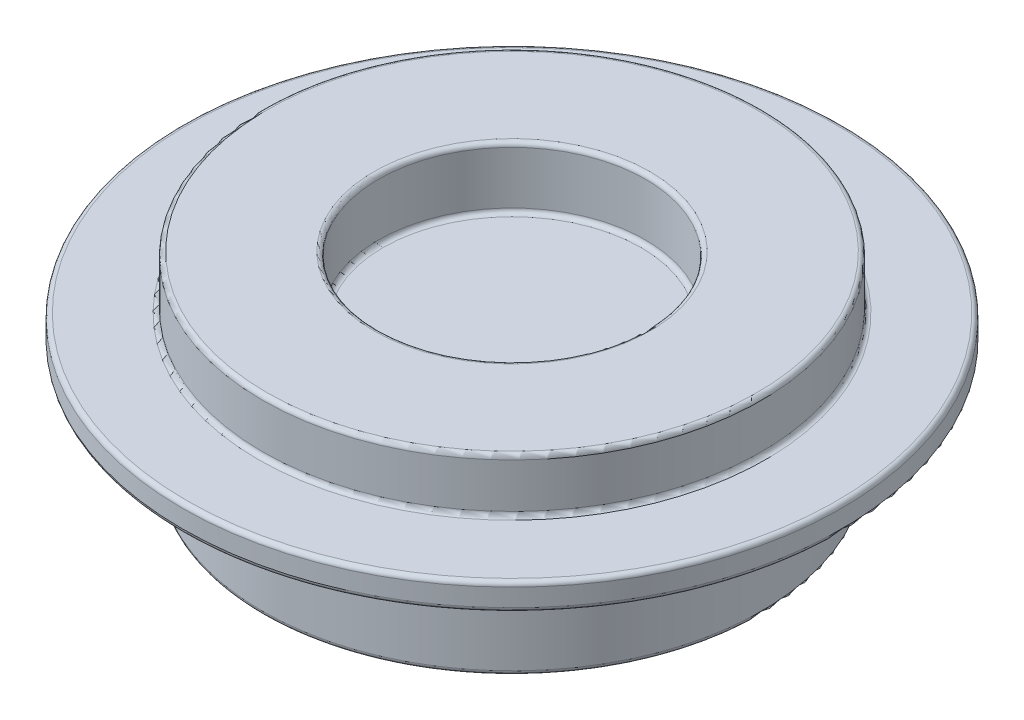
ISO-10303-21;
HEADER;
FILE_DESCRIPTION(('STEP AP214'),'2;1');
FILE_NAME('part.step','',(''),(''),'','','');
FILE_SCHEMA(('AUTOMOTIVE_DESIGN { 1 0 10303 214 1 1 1 1 }'));
ENDSEC;
DATA;
#1=APPLICATION_CONTEXT('core data for automotive mechanical design processes');
#2=APPLICATION_PROTOCOL_DEFINITION('international standard','automotive_design',2000,#1);
#3=PRODUCT_CONTEXT('',#1,'mechanical');
#4=PRODUCT('Part','Part','',(#3));
#5=PRODUCT_RELATED_PRODUCT_CATEGORY('part','',(#4));
#6=PRODUCT_DEFINITION_FORMATION('','',#4);
#7=PRODUCT_DEFINITION_CONTEXT('part definition',#1,'design');
#8=PRODUCT_DEFINITION('design','',#6,#7);
#9=PRODUCT_DEFINITION_SHAPE('','',#8);
#10=(LENGTH_UNIT() NAMED_UNIT(*) SI_UNIT(.MILLI.,.METRE.));
#11=(NAMED_UNIT(*) PLANE_ANGLE_UNIT() SI_UNIT($,.RADIAN.));
#12=(NAMED_UNIT(*) SI_UNIT($,.STERADIAN.) SOLID_ANGLE_UNIT());
#13=UNCERTAINTY_MEASURE_WITH_UNIT(LENGTH_MEASURE(1.E-05),#10,'distance_accuracy_value','');
#14=(GEOMETRIC_REPRESENTATION_CONTEXT(3) GLOBAL_UNCERTAINTY_ASSIGNED_CONTEXT((#13)) GLOBAL_UNIT_ASSIGNED_CONTEXT((#10,
#11,#12)) REPRESENTATION_CONTEXT('',''));
#15=CARTESIAN_POINT('',(0.,0.,0.));
#16=DIRECTION('',(0.,0.,1.));
#17=DIRECTION('',(1.,0.,0.));
#18=AXIS2_PLACEMENT_3D('',#15,#16,#17);
#19=CARTESIAN_POINT('',(0.,8.16014669926651,0.));
#20=DIRECTION('',(0.,1.,0.));
#21=DIRECTION('',(0.,0.,1.));
#22=AXIS2_PLACEMENT_3D('',#19,#20,#21);
#23=CYLINDRICAL_SURFACE('',#22,14.);
#24=CARTESIAN_POINT('',(0.,1.74266503667482,0.));
#25=DIRECTION('',(0.,1.,0.));
#26=DIRECTION('',(0.,0.,1.));
#27=AXIS2_PLACEMENT_3D('',#24,#25,#26);
#28=CIRCLE('',#27,14.);
#29=CARTESIAN_POINT('',(0.,1.74266503667482,14.));
#30=VERTEX_POINT('',#29);
#31=EDGE_CURVE('E60',#30,#30,#28,.T.);
#32=ORIENTED_EDGE('',*,*,#31,.T.);
#33=EDGE_LOOP('',(#32));
#34=FACE_BOUND('',#33,.T.);
#35=CARTESIAN_POINT('',(0.,4.24266503667482,0.));
#36=DIRECTION('',(0.,1.,0.));
#37=DIRECTION('',(0.,0.,1.));
#38=AXIS2_PLACEMENT_3D('',#35,#36,#37);
#39=CIRCLE('',#38,14.);
#40=CARTESIAN_POINT('',(0.,4.24266503667482,14.));
#41=VERTEX_POINT('',#40);
#42=EDGE_CURVE('E63',#41,#41,#39,.F.);
#43=ORIENTED_EDGE('',*,*,#42,.T.);
#44=EDGE_LOOP('',(#43));
#45=FACE_BOUND('',#44,.T.);
#46=ADVANCED_FACE('F37',(#34,#45),#23,.T.);
#47=CARTESIAN_POINT('',(-14.,4.49266503667482,0.));
#48=DIRECTION('',(0.,1.,0.));
#49=DIRECTION('',(0.,0.,1.));
#50=AXIS2_PLACEMENT_3D('',#47,#48,#49);
#51=PLANE('',#50);
#52=CARTESIAN_POINT('',(0.,4.49266503667482,0.));
#53=DIRECTION('',(0.,1.,0.));
#54=DIRECTION('',(0.,0.,1.));
#55=AXIS2_PLACEMENT_3D('',#52,#53,#54);
#56=CIRCLE('',#55,7.75);
#57=CARTESIAN_POINT('',(0.,4.49266503667482,7.75));
#58=VERTEX_POINT('',#57);
#59=EDGE_CURVE('E78',#58,#58,#56,.F.);
#60=ORIENTED_EDGE('',*,*,#59,.T.);
#61=EDGE_LOOP('',(#60));
#62=FACE_BOUND('',#61,.T.);
#63=CARTESIAN_POINT('',(0.,4.49266503667482,0.));
#64=DIRECTION('',(0.,1.,0.));
#65=DIRECTION('',(0.,0.,1.));
#66=AXIS2_PLACEMENT_3D('',#63,#64,#65);
#67=CIRCLE('',#66,13.75);
#68=CARTESIAN_POINT('',(0.,4.49266503667482,13.75));
#69=VERTEX_POINT('',#68);
#70=EDGE_CURVE('E81',#69,#69,#67,.T.);
#71=ORIENTED_EDGE('',*,*,#70,.T.);
#72=EDGE_LOOP('',(#71));
#73=FACE_BOUND('',#72,.T.);
#74=ADVANCED_FACE('F115',(#62,#73),#51,.T.);
#75=CARTESIAN_POINT('',(0.,8.16014669926651,0.));
#76=DIRECTION('',(0.,1.,0.));
#77=DIRECTION('',(0.,0.,1.));
#78=AXIS2_PLACEMENT_3D('',#75,#76,#77);
#79=CYLINDRICAL_SURFACE('',#78,7.5);
#80=CARTESIAN_POINT('',(0.,1.29523227383863,0.));
#81=DIRECTION('',(0.,1.,0.));
#82=DIRECTION('',(0.,0.,1.));
#83=AXIS2_PLACEMENT_3D('',#80,#81,#82);
#84=CIRCLE('',#83,7.5);
#85=CARTESIAN_POINT('',(0.,1.29523227383863,7.5));
#86=VERTEX_POINT('',#85);
#87=EDGE_CURVE('E84',#86,#86,#84,.F.);
#88=ORIENTED_EDGE('',*,*,#87,.T.);
#89=EDGE_LOOP('',(#88));
#90=FACE_BOUND('',#89,.T.);
#91=CARTESIAN_POINT('',(0.,4.24266503667482,0.));
#92=DIRECTION('',(0.,1.,0.));
#93=DIRECTION('',(0.,0.,1.));
#94=AXIS2_PLACEMENT_3D('',#91,#92,#93);
#95=CIRCLE('',#94,7.5);
#96=CARTESIAN_POINT('',(0.,4.24266503667482,7.5));
#97=VERTEX_POINT('',#96);
#98=EDGE_CURVE('E87',#97,#97,#95,.T.);
#99=ORIENTED_EDGE('',*,*,#98,.T.);
#100=EDGE_LOOP('',(#99));
#101=FACE_BOUND('',#100,.T.);
#102=ADVANCED_FACE('F120',(#90,#101),#79,.F.);
#103=CARTESIAN_POINT('',(-7.5,1.04523227383863,0.));
#104=DIRECTION('',(0.,1.,0.));
#105=DIRECTION('',(0.,0.,1.));
#106=AXIS2_PLACEMENT_3D('',#103,#104,#105);
#107=PLANE('',#106);
#108=CARTESIAN_POINT('',(0.,1.04523227383863,0.));
#109=DIRECTION('',(0.,1.,0.));
#110=DIRECTION('',(0.,0.,1.));
#111=AXIS2_PLACEMENT_3D('',#108,#109,#110);
#112=CIRCLE('',#111,7.25);
#113=CARTESIAN_POINT('',(0.,1.04523227383863,7.25));
#114=VERTEX_POINT('',#113);
#115=EDGE_CURVE('E90',#114,#114,#112,.T.);
#116=ORIENTED_EDGE('',*,*,#115,.T.);
#117=EDGE_LOOP('',(#116));
#118=FACE_BOUND('',#117,.T.);
#119=ADVANCED_FACE('F94',(#118),#107,.T.);
#120=CARTESIAN_POINT('',(-14.,-6.25733496332518,0.));
#121=DIRECTION('',(0.,-1.,0.));
#122=DIRECTION('',(0.,0.,-1.));
#123=AXIS2_PLACEMENT_3D('',#120,#121,#122);
#124=PLANE('',#123);
#125=CARTESIAN_POINT('',(0.,-6.25733496332518,0.));
#126=DIRECTION('',(0.,-1.,0.));
#127=DIRECTION('',(0.,0.,-1.));
#128=AXIS2_PLACEMENT_3D('',#125,#126,#127);
#129=CIRCLE('',#128,13.75);
#130=CARTESIAN_POINT('',(0.,-6.25733496332518,-13.75));
#131=VERTEX_POINT('',#130);
#132=EDGE_CURVE('E48',#131,#131,#129,.T.);
#133=ORIENTED_EDGE('',*,*,#132,.T.);
#134=EDGE_LOOP('',(#133));
#135=FACE_BOUND('',#134,.T.);
#136=ADVANCED_FACE('F130',(#135),#124,.T.);
#137=CARTESIAN_POINT('',(0.,8.16014669926651,0.));
#138=DIRECTION('',(0.,1.,0.));
#139=DIRECTION('',(0.,0.,1.));
#140=AXIS2_PLACEMENT_3D('',#137,#138,#139);
#141=CYLINDRICAL_SURFACE('',#140,14.);
#142=CARTESIAN_POINT('',(0.,-0.25733496332518,0.));
#143=DIRECTION('',(0.,-1.,0.));
#144=DIRECTION('',(0.,0.,-1.));
#145=AXIS2_PLACEMENT_3D('',#142,#143,#144);
#146=CIRCLE('',#145,14.);
#147=CARTESIAN_POINT('',(0.,-0.25733496332518,-14.));
#148=VERTEX_POINT('',#147);
#149=EDGE_CURVE('E66',#148,#148,#146,.T.);
#150=ORIENTED_EDGE('',*,*,#149,.T.);
#151=EDGE_LOOP('',(#150));
#152=FACE_BOUND('',#151,.T.);
#153=CARTESIAN_POINT('',(0.,-6.00733496332518,0.));
#154=DIRECTION('',(0.,-1.,0.));
#155=DIRECTION('',(0.,0.,-1.));
#156=AXIS2_PLACEMENT_3D('',#153,#154,#155);
#157=CIRCLE('',#156,14.);
#158=CARTESIAN_POINT('',(0.,-6.00733496332518,-14.));
#159=VERTEX_POINT('',#158);
#160=EDGE_CURVE('E69',#159,#159,#157,.F.);
#161=ORIENTED_EDGE('',*,*,#160,.T.);
#162=EDGE_LOOP('',(#161));
#163=FACE_BOUND('',#162,.T.);
#164=ADVANCED_FACE('F133',(#152,#163),#141,.T.);
#165=CARTESIAN_POINT('',(-18.5,-0.00733496332518002,0.));
#166=DIRECTION('',(0.,-1.,0.));
#167=DIRECTION('',(0.,0.,-1.));
#168=AXIS2_PLACEMENT_3D('',#165,#166,#167);
#169=PLANE('',#168);
#170=CARTESIAN_POINT('',(0.,-0.00733496332518005,0.));
#171=DIRECTION('',(0.,-1.,0.));
#172=DIRECTION('',(0.,0.,-1.));
#173=AXIS2_PLACEMENT_3D('',#170,#171,#172);
#174=CIRCLE('',#173,14.25);
#175=CARTESIAN_POINT('',(0.,-0.00733496332518005,-14.25));
#176=VERTEX_POINT('',#175);
#177=EDGE_CURVE('E72',#176,#176,#174,.F.);
#178=ORIENTED_EDGE('',*,*,#177,.T.);
#179=EDGE_LOOP('',(#178));
#180=FACE_BOUND('',#179,.T.);
#181=CARTESIAN_POINT('',(0.,-0.00733496332518005,0.));
#182=DIRECTION('',(0.,-1.,0.));
#183=DIRECTION('',(0.,0.,-1.));
#184=AXIS2_PLACEMENT_3D('',#181,#182,#183);
#185=CIRCLE('',#184,18.25);
#186=CARTESIAN_POINT('',(0.,-0.00733496332518005,-18.25));
#187=VERTEX_POINT('',#186);
#188=EDGE_CURVE('E75',#187,#187,#185,.T.);
#189=ORIENTED_EDGE('',*,*,#188,.T.);
#190=EDGE_LOOP('',(#189));
#191=FACE_BOUND('',#190,.T.);
#192=ADVANCED_FACE('F137',(#180,#191),#169,.T.);
#193=CARTESIAN_POINT('',(0.,8.16014669926651,0.));
#194=DIRECTION('',(0.,1.,0.));
#195=DIRECTION('',(0.,0.,1.));
#196=AXIS2_PLACEMENT_3D('',#193,#194,#195);
#197=CYLINDRICAL_SURFACE('',#196,18.5);
#198=CARTESIAN_POINT('',(0.,0.242665036674821,0.));
#199=DIRECTION('',(0.,-1.,0.));
#200=DIRECTION('',(0.,0.,-1.));
#201=AXIS2_PLACEMENT_3D('',#198,#199,#200);
#202=CIRCLE('',#201,18.5);
#203=CARTESIAN_POINT('',(0.,0.242665036674821,-18.5));
#204=VERTEX_POINT('',#203);
#205=EDGE_CURVE('E10',#204,#204,#202,.F.);
#206=ORIENTED_EDGE('',*,*,#205,.T.);
#207=EDGE_LOOP('',(#206));
#208=FACE_BOUND('',#207,.T.);
#209=CARTESIAN_POINT('',(0.,1.24266503667482,0.));
#210=DIRECTION('',(0.,1.,0.));
#211=DIRECTION('',(0.,0.,1.));
#212=AXIS2_PLACEMENT_3D('',#209,#210,#211);
#213=CIRCLE('',#212,18.5);
#214=CARTESIAN_POINT('',(0.,1.24266503667482,18.5));
#215=VERTEX_POINT('',#214);
#216=EDGE_CURVE('E44',#215,#215,#213,.F.);
#217=ORIENTED_EDGE('',*,*,#216,.T.);
#218=EDGE_LOOP('',(#217));
#219=FACE_BOUND('',#218,.T.);
#220=ADVANCED_FACE('F109',(#208,#219),#197,.T.);
#221=CARTESIAN_POINT('',(-14.,1.49266503667482,0.));
#222=DIRECTION('',(0.,1.,0.));
#223=DIRECTION('',(0.,0.,1.));
#224=AXIS2_PLACEMENT_3D('',#221,#222,#223);
#225=PLANE('',#224);
#226=CARTESIAN_POINT('',(0.,1.49266503667482,0.));
#227=DIRECTION('',(0.,1.,0.));
#228=DIRECTION('',(0.,0.,1.));
#229=AXIS2_PLACEMENT_3D('',#226,#227,#228);
#230=CIRCLE('',#229,14.25);
#231=CARTESIAN_POINT('',(0.,1.49266503667482,14.25));
#232=VERTEX_POINT('',#231);
#233=EDGE_CURVE('E52',#232,#232,#230,.F.);
#234=ORIENTED_EDGE('',*,*,#233,.T.);
#235=EDGE_LOOP('',(#234));
#236=FACE_BOUND('',#235,.T.);
#237=CARTESIAN_POINT('',(0.,1.49266503667482,0.));
#238=DIRECTION('',(0.,1.,0.));
#239=DIRECTION('',(0.,0.,1.));
#240=AXIS2_PLACEMENT_3D('',#237,#238,#239);
#241=CIRCLE('',#240,18.25);
#242=CARTESIAN_POINT('',(0.,1.49266503667482,18.25));
#243=VERTEX_POINT('',#242);
#244=EDGE_CURVE('E57',#243,#243,#241,.T.);
#245=ORIENTED_EDGE('',*,*,#244,.T.);
#246=EDGE_LOOP('',(#245));
#247=FACE_BOUND('',#246,.T.);
#248=ADVANCED_FACE('F99',(#236,#247),#225,.T.);
#249=CARTESIAN_POINT('',(0.,1.29523227383863,0.));
#250=DIRECTION('',(0.,1.,0.));
#251=DIRECTION('',(0.,0.,1.));
#252=AXIS2_PLACEMENT_3D('',#249,#250,#251);
#253=TOROIDAL_SURFACE('',#252,7.25,0.25);
#254=ORIENTED_EDGE('',*,*,#87,.F.);
#255=EDGE_LOOP('',(#254));
#256=FACE_BOUND('',#255,.T.);
#257=ORIENTED_EDGE('',*,*,#115,.F.);
#258=EDGE_LOOP('',(#257));
#259=FACE_BOUND('',#258,.T.);
#260=ADVANCED_FACE('F96',(#256,#259),#253,.F.);
#261=CARTESIAN_POINT('',(0.,4.24266503667482,0.));
#262=DIRECTION('',(0.,1.,0.));
#263=DIRECTION('',(0.,0.,1.));
#264=AXIS2_PLACEMENT_3D('',#261,#262,#263);
#265=TOROIDAL_SURFACE('',#264,7.75,0.25);
#266=ORIENTED_EDGE('',*,*,#59,.F.);
#267=EDGE_LOOP('',(#266));
#268=FACE_BOUND('',#267,.T.);
#269=ORIENTED_EDGE('',*,*,#98,.F.);
#270=EDGE_LOOP('',(#269));
#271=FACE_BOUND('',#270,.T.);
#272=ADVANCED_FACE('F98',(#268,#271),#265,.T.);
#273=CARTESIAN_POINT('',(0.,-0.25733496332518,0.));
#274=DIRECTION('',(0.,-1.,0.));
#275=DIRECTION('',(0.,0.,-1.));
#276=AXIS2_PLACEMENT_3D('',#273,#274,#275);
#277=TOROIDAL_SURFACE('',#276,14.25,0.25);
#278=ORIENTED_EDGE('',*,*,#149,.F.);
#279=EDGE_LOOP('',(#278));
#280=FACE_BOUND('',#279,.T.);
#281=ORIENTED_EDGE('',*,*,#177,.F.);
#282=EDGE_LOOP('',(#281));
#283=FACE_BOUND('',#282,.T.);
#284=ADVANCED_FACE('F106',(#280,#283),#277,.F.);
#285=CARTESIAN_POINT('',(0.,1.74266503667482,0.));
#286=DIRECTION('',(0.,1.,0.));
#287=DIRECTION('',(0.,0.,1.));
#288=AXIS2_PLACEMENT_3D('',#285,#286,#287);
#289=TOROIDAL_SURFACE('',#288,14.25,0.25);
#290=ORIENTED_EDGE('',*,*,#233,.F.);
#291=EDGE_LOOP('',(#290));
#292=FACE_BOUND('',#291,.T.);
#293=ORIENTED_EDGE('',*,*,#31,.F.);
#294=EDGE_LOOP('',(#293));
#295=FACE_BOUND('',#294,.T.);
#296=ADVANCED_FACE('F172',(#292,#295),#289,.F.);
#297=CARTESIAN_POINT('',(0.,-6.00733496332518,0.));
#298=DIRECTION('',(0.,-1.,0.));
#299=DIRECTION('',(0.,0.,-1.));
#300=AXIS2_PLACEMENT_3D('',#297,#298,#299);
#301=TOROIDAL_SURFACE('',#300,13.75,0.25);
#302=ORIENTED_EDGE('',*,*,#132,.F.);
#303=EDGE_LOOP('',(#302));
#304=FACE_BOUND('',#303,.T.);
#305=ORIENTED_EDGE('',*,*,#160,.F.);
#306=EDGE_LOOP('',(#305));
#307=FACE_BOUND('',#306,.T.);
#308=ADVANCED_FACE('F182',(#304,#307),#301,.T.);
#309=CARTESIAN_POINT('',(0.,0.242665036674821,0.));
#310=DIRECTION('',(0.,-1.,0.));
#311=DIRECTION('',(0.,0.,-1.));
#312=AXIS2_PLACEMENT_3D('',#309,#310,#311);
#313=TOROIDAL_SURFACE('',#312,18.25,0.25);
#314=ORIENTED_EDGE('',*,*,#188,.F.);
#315=EDGE_LOOP('',(#314));
#316=FACE_BOUND('',#315,.T.);
#317=ORIENTED_EDGE('',*,*,#205,.F.);
#318=EDGE_LOOP('',(#317));
#319=FACE_BOUND('',#318,.T.);
#320=ADVANCED_FACE('F192',(#316,#319),#313,.T.);
#321=CARTESIAN_POINT('',(0.,1.24266503667482,0.));
#322=DIRECTION('',(0.,1.,0.));
#323=DIRECTION('',(0.,0.,1.));
#324=AXIS2_PLACEMENT_3D('',#321,#322,#323);
#325=TOROIDAL_SURFACE('',#324,18.25,0.25);
#326=ORIENTED_EDGE('',*,*,#216,.F.);
#327=EDGE_LOOP('',(#326));
#328=FACE_BOUND('',#327,.T.);
#329=ORIENTED_EDGE('',*,*,#244,.F.);
#330=EDGE_LOOP('',(#329));
#331=FACE_BOUND('',#330,.T.);
#332=ADVANCED_FACE('F202',(#328,#331),#325,.T.);
#333=CARTESIAN_POINT('',(0.,4.24266503667482,0.));
#334=DIRECTION('',(0.,1.,0.));
#335=DIRECTION('',(0.,0.,1.));
#336=AXIS2_PLACEMENT_3D('',#333,#334,#335);
#337=TOROIDAL_SURFACE('',#336,13.75,0.25);
#338=ORIENTED_EDGE('',*,*,#42,.F.);
#339=EDGE_LOOP('',(#338));
#340=FACE_BOUND('',#339,.T.);
#341=ORIENTED_EDGE('',*,*,#70,.F.);
#342=EDGE_LOOP('',(#341));
#343=FACE_BOUND('',#342,.T.);
#344=ADVANCED_FACE('F39',(#340,#343),#337,.T.);
#345=CLOSED_SHELL('',(#46,#74,#102,#119,#136,#164,#192,#220,#248,#260,#272,#284,#296,#308,#320,
#332,#344));
#346=MANIFOLD_SOLID_BREP('B2',#345);
#347=ADVANCED_BREP_SHAPE_REPRESENTATION('',(#18,#346),#14);
#348=SHAPE_DEFINITION_REPRESENTATION(#9,#347);
ENDSEC;
END-ISO-10303-21;
